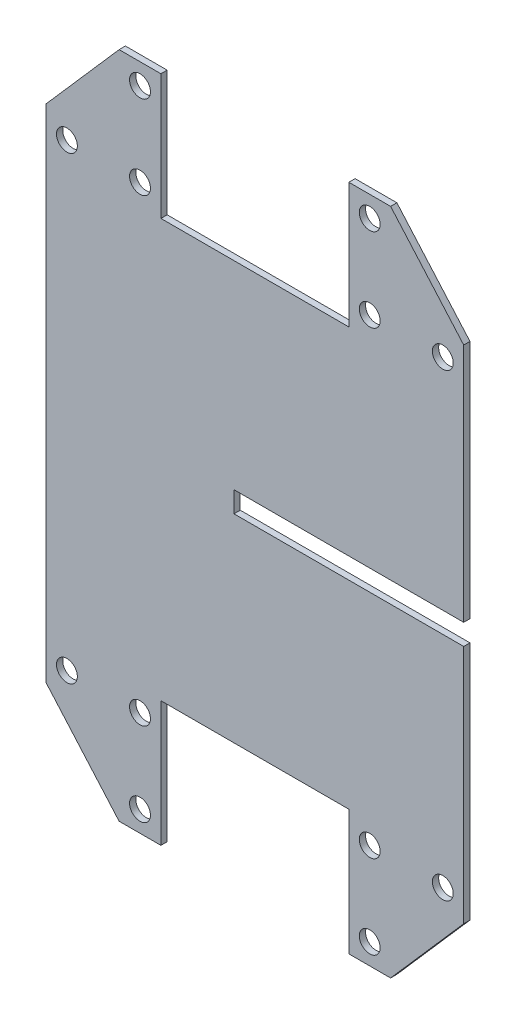
ISO-10303-21;
HEADER;
FILE_DESCRIPTION(('STEP AP214'),'2;1');
FILE_NAME('part.step','',(''),(''),'','','');
FILE_SCHEMA(('AUTOMOTIVE_DESIGN { 1 0 10303 214 1 1 1 1 }'));
ENDSEC;
DATA;
#1=APPLICATION_CONTEXT('core data for automotive mechanical design processes');
#2=APPLICATION_PROTOCOL_DEFINITION('international standard','automotive_design',2000,#1);
#3=PRODUCT_CONTEXT('',#1,'mechanical');
#4=PRODUCT('Part','Part','',(#3));
#5=PRODUCT_RELATED_PRODUCT_CATEGORY('part','',(#4));
#6=PRODUCT_DEFINITION_FORMATION('','',#4);
#7=PRODUCT_DEFINITION_CONTEXT('part definition',#1,'design');
#8=PRODUCT_DEFINITION('design','',#6,#7);
#9=PRODUCT_DEFINITION_SHAPE('','',#8);
#10=(LENGTH_UNIT() NAMED_UNIT(*) SI_UNIT(.MILLI.,.METRE.));
#11=(NAMED_UNIT(*) PLANE_ANGLE_UNIT() SI_UNIT($,.RADIAN.));
#12=(NAMED_UNIT(*) SI_UNIT($,.STERADIAN.) SOLID_ANGLE_UNIT());
#13=UNCERTAINTY_MEASURE_WITH_UNIT(LENGTH_MEASURE(1.E-05),#10,'distance_accuracy_value','');
#14=(GEOMETRIC_REPRESENTATION_CONTEXT(3) GLOBAL_UNCERTAINTY_ASSIGNED_CONTEXT((#13)) GLOBAL_UNIT_ASSIGNED_CONTEXT((#10,
#11,#12)) REPRESENTATION_CONTEXT('',''));
#15=CARTESIAN_POINT('',(0.,0.,0.));
#16=DIRECTION('',(0.,0.,1.));
#17=DIRECTION('',(1.,0.,0.));
#18=AXIS2_PLACEMENT_3D('',#15,#16,#17);
#19=CARTESIAN_POINT('',(0.,160.,3.));
#20=DIRECTION('',(0.,1.,0.));
#21=DIRECTION('',(0.,0.,1.));
#22=AXIS2_PLACEMENT_3D('',#19,#20,#21);
#23=PLANE('',#22);
#24=DIRECTION('',(1.,0.,0.));
#25=VECTOR('',#24,1.);
#26=CARTESIAN_POINT('',(0.,160.,0.));
#27=LINE('',#26,#25);
#28=CARTESIAN_POINT('',(35.,160.,0.));
#29=VERTEX_POINT('',#28);
#30=CARTESIAN_POINT('',(55.,160.,0.));
#31=VERTEX_POINT('',#30);
#32=EDGE_CURVE('E168',#29,#31,#27,.T.);
#33=ORIENTED_EDGE('',*,*,#32,.F.);
#34=DIRECTION('',(0.,0.,-1.));
#35=VECTOR('',#34,1.);
#36=CARTESIAN_POINT('',(35.,160.,3.));
#37=LINE('',#36,#35);
#38=CARTESIAN_POINT('',(35.,160.,3.));
#39=VERTEX_POINT('',#38);
#40=EDGE_CURVE('E11',#39,#29,#37,.T.);
#41=ORIENTED_EDGE('',*,*,#40,.F.);
#42=DIRECTION('',(1.,0.,0.));
#43=VECTOR('',#42,1.);
#44=CARTESIAN_POINT('',(0.,160.,3.));
#45=LINE('',#44,#43);
#46=CARTESIAN_POINT('',(55.,160.,3.));
#47=VERTEX_POINT('',#46);
#48=EDGE_CURVE('E297',#39,#47,#45,.T.);
#49=ORIENTED_EDGE('',*,*,#48,.T.);
#50=DIRECTION('',(0.,0.,-1.));
#51=VECTOR('',#50,1.);
#52=CARTESIAN_POINT('',(55.,160.,3.));
#53=LINE('',#52,#51);
#54=EDGE_CURVE('E95',#47,#31,#53,.T.);
#55=ORIENTED_EDGE('',*,*,#54,.T.);
#56=EDGE_LOOP('',(#33,#41,#49,#55));
#57=FACE_BOUND('',#56,.T.);
#58=ADVANCED_FACE('F37',(#57),#23,.T.);
#59=CARTESIAN_POINT('',(-59.4690265486726,52.0353982300884,3.));
#60=DIRECTION('',(0.752576694706878,-0.658504607868518,0.));
#61=DIRECTION('',(0.658504607868518,0.752576694706878,0.));
#62=AXIS2_PLACEMENT_3D('',#59,#60,#61);
#63=PLANE('',#62);
#64=DIRECTION('',(-0.658504607868518,-0.752576694706878,0.));
#65=VECTOR('',#64,1.);
#66=CARTESIAN_POINT('',(-59.4690265486726,52.0353982300884,0.));
#67=LINE('',#66,#65);
#68=CARTESIAN_POINT('',(0.,120.,0.));
#69=VERTEX_POINT('',#68);
#70=EDGE_CURVE('E171',#29,#69,#67,.T.);
#71=ORIENTED_EDGE('',*,*,#70,.T.);
#72=DIRECTION('',(0.,0.,-1.));
#73=VECTOR('',#72,1.);
#74=CARTESIAN_POINT('',(0.,120.,3.));
#75=LINE('',#74,#73);
#76=CARTESIAN_POINT('',(0.,120.,3.));
#77=VERTEX_POINT('',#76);
#78=EDGE_CURVE('E46',#77,#69,#75,.T.);
#79=ORIENTED_EDGE('',*,*,#78,.F.);
#80=DIRECTION('',(-0.658504607868518,-0.752576694706878,0.));
#81=VECTOR('',#80,1.);
#82=CARTESIAN_POINT('',(-59.4690265486726,52.0353982300884,3.));
#83=LINE('',#82,#81);
#84=EDGE_CURVE('E299',#39,#77,#83,.T.);
#85=ORIENTED_EDGE('',*,*,#84,.F.);
#86=ORIENTED_EDGE('',*,*,#40,.T.);
#87=EDGE_LOOP('',(#71,#79,#85,#86));
#88=FACE_BOUND('',#87,.T.);
#89=ADVANCED_FACE('F229',(#88),#63,.F.);
#90=CARTESIAN_POINT('',(0.,0.,3.));
#91=DIRECTION('',(-1.,0.,0.));
#92=DIRECTION('',(0.,0.,1.));
#93=AXIS2_PLACEMENT_3D('',#90,#91,#92);
#94=PLANE('',#93);
#95=DIRECTION('',(0.,1.,0.));
#96=VECTOR('',#95,1.);
#97=CARTESIAN_POINT('',(0.,0.,0.));
#98=LINE('',#97,#96);
#99=CARTESIAN_POINT('',(0.,-120.,0.));
#100=VERTEX_POINT('',#99);
#101=EDGE_CURVE('E174',#100,#69,#98,.T.);
#102=ORIENTED_EDGE('',*,*,#101,.F.);
#103=DIRECTION('',(0.,0.,-1.));
#104=VECTOR('',#103,1.);
#105=CARTESIAN_POINT('',(0.,-120.,3.));
#106=LINE('',#105,#104);
#107=CARTESIAN_POINT('',(0.,-120.,3.));
#108=VERTEX_POINT('',#107);
#109=EDGE_CURVE('E263',#108,#100,#106,.T.);
#110=ORIENTED_EDGE('',*,*,#109,.F.);
#111=DIRECTION('',(0.,1.,0.));
#112=VECTOR('',#111,1.);
#113=CARTESIAN_POINT('',(0.,0.,3.));
#114=LINE('',#113,#112);
#115=EDGE_CURVE('E226',#108,#77,#114,.T.);
#116=ORIENTED_EDGE('',*,*,#115,.T.);
#117=ORIENTED_EDGE('',*,*,#78,.T.);
#118=EDGE_LOOP('',(#102,#110,#116,#117));
#119=FACE_BOUND('',#118,.T.);
#120=ADVANCED_FACE('F221',(#119),#94,.T.);
#121=CARTESIAN_POINT('',(90.,2.4980018054066E-13,3.));
#122=DIRECTION('',(-1.,0.,0.));
#123=DIRECTION('',(0.,-1.,0.));
#124=AXIS2_PLACEMENT_3D('',#121,#122,#123);
#125=PLANE('',#124);
#126=DIRECTION('',(0.,1.,0.));
#127=VECTOR('',#126,1.);
#128=CARTESIAN_POINT('',(90.,2.4980018054066E-13,0.));
#129=LINE('',#128,#127);
#130=CARTESIAN_POINT('',(90.,-4.99999999999999,0.));
#131=VERTEX_POINT('',#130);
#132=CARTESIAN_POINT('',(90.,4.99999999999998,0.));
#133=VERTEX_POINT('',#132);
#134=EDGE_CURVE('E177',#131,#133,#129,.T.);
#135=ORIENTED_EDGE('',*,*,#134,.T.);
#136=DIRECTION('',(0.,0.,-1.));
#137=VECTOR('',#136,1.);
#138=CARTESIAN_POINT('',(90.,4.99999999999998,3.));
#139=LINE('',#138,#137);
#140=CARTESIAN_POINT('',(90.,4.99999999999998,3.));
#141=VERTEX_POINT('',#140);
#142=EDGE_CURVE('E216',#141,#133,#139,.T.);
#143=ORIENTED_EDGE('',*,*,#142,.F.);
#144=DIRECTION('',(0.,1.,0.));
#145=VECTOR('',#144,1.);
#146=CARTESIAN_POINT('',(90.,2.4980018054066E-13,3.));
#147=LINE('',#146,#145);
#148=CARTESIAN_POINT('',(90.,-4.99999999999999,3.));
#149=VERTEX_POINT('',#148);
#150=EDGE_CURVE('E302',#149,#141,#147,.T.);
#151=ORIENTED_EDGE('',*,*,#150,.F.);
#152=DIRECTION('',(0.,0.,-1.));
#153=VECTOR('',#152,1.);
#154=CARTESIAN_POINT('',(90.,-4.99999999999999,3.));
#155=LINE('',#154,#153);
#156=EDGE_CURVE('E266',#149,#131,#155,.T.);
#157=ORIENTED_EDGE('',*,*,#156,.T.);
#158=EDGE_LOOP('',(#135,#143,#151,#157));
#159=FACE_BOUND('',#158,.T.);
#160=ADVANCED_FACE('F434',(#159),#125,.F.);
#161=CARTESIAN_POINT('',(0.,4.99999999999997,3.));
#162=DIRECTION('',(0.,-1.,0.));
#163=DIRECTION('',(1.,0.,0.));
#164=AXIS2_PLACEMENT_3D('',#161,#162,#163);
#165=PLANE('',#164);
#166=DIRECTION('',(-1.,0.,0.));
#167=VECTOR('',#166,1.);
#168=CARTESIAN_POINT('',(0.,4.99999999999997,0.));
#169=LINE('',#168,#167);
#170=CARTESIAN_POINT('',(200.,5.,0.));
#171=VERTEX_POINT('',#170);
#172=EDGE_CURVE('E180',#171,#133,#169,.T.);
#173=ORIENTED_EDGE('',*,*,#172,.F.);
#174=DIRECTION('',(0.,0.,-1.));
#175=VECTOR('',#174,1.);
#176=CARTESIAN_POINT('',(200.,5.,3.));
#177=LINE('',#176,#175);
#178=CARTESIAN_POINT('',(200.,5.,3.));
#179=VERTEX_POINT('',#178);
#180=EDGE_CURVE('E214',#179,#171,#177,.T.);
#181=ORIENTED_EDGE('',*,*,#180,.F.);
#182=DIRECTION('',(-1.,0.,0.));
#183=VECTOR('',#182,1.);
#184=CARTESIAN_POINT('',(0.,4.99999999999997,3.));
#185=LINE('',#184,#183);
#186=EDGE_CURVE('E304',#179,#141,#185,.T.);
#187=ORIENTED_EDGE('',*,*,#186,.T.);
#188=ORIENTED_EDGE('',*,*,#142,.T.);
#189=EDGE_LOOP('',(#173,#181,#187,#188));
#190=FACE_BOUND('',#189,.T.);
#191=ADVANCED_FACE('F443',(#190),#165,.T.);
#192=CARTESIAN_POINT('',(200.,0.,3.));
#193=DIRECTION('',(1.,0.,0.));
#194=DIRECTION('',(0.,0.,-1.));
#195=AXIS2_PLACEMENT_3D('',#192,#193,#194);
#196=PLANE('',#195);
#197=DIRECTION('',(0.,-1.,0.));
#198=VECTOR('',#197,1.);
#199=CARTESIAN_POINT('',(200.,0.,0.));
#200=LINE('',#199,#198);
#201=CARTESIAN_POINT('',(200.,120.,0.));
#202=VERTEX_POINT('',#201);
#203=EDGE_CURVE('E183',#202,#171,#200,.T.);
#204=ORIENTED_EDGE('',*,*,#203,.F.);
#205=DIRECTION('',(0.,0.,-1.));
#206=VECTOR('',#205,1.);
#207=CARTESIAN_POINT('',(200.,120.,3.));
#208=LINE('',#207,#206);
#209=CARTESIAN_POINT('',(200.,120.,3.));
#210=VERTEX_POINT('',#209);
#211=EDGE_CURVE('E212',#210,#202,#208,.T.);
#212=ORIENTED_EDGE('',*,*,#211,.F.);
#213=DIRECTION('',(0.,-1.,0.));
#214=VECTOR('',#213,1.);
#215=CARTESIAN_POINT('',(200.,0.,3.));
#216=LINE('',#215,#214);
#217=EDGE_CURVE('E307',#210,#179,#216,.T.);
#218=ORIENTED_EDGE('',*,*,#217,.T.);
#219=ORIENTED_EDGE('',*,*,#180,.T.);
#220=EDGE_LOOP('',(#204,#212,#218,#219));
#221=FACE_BOUND('',#220,.T.);
#222=ADVANCED_FACE('F319',(#221),#196,.T.);
#223=CARTESIAN_POINT('',(172.743362831858,151.150442477876,3.));
#224=DIRECTION('',(0.752576694706877,0.658504607868518,0.));
#225=DIRECTION('',(-0.658504607868519,0.752576694706877,0.));
#226=AXIS2_PLACEMENT_3D('',#223,#224,#225);
#227=PLANE('',#226);
#228=DIRECTION('',(0.658504607868519,-0.752576694706877,0.));
#229=VECTOR('',#228,1.);
#230=CARTESIAN_POINT('',(172.743362831858,151.150442477876,0.));
#231=LINE('',#230,#229);
#232=CARTESIAN_POINT('',(165.,160.,0.));
#233=VERTEX_POINT('',#232);
#234=EDGE_CURVE('E186',#233,#202,#231,.T.);
#235=ORIENTED_EDGE('',*,*,#234,.F.);
#236=DIRECTION('',(0.,0.,-1.));
#237=VECTOR('',#236,1.);
#238=CARTESIAN_POINT('',(165.,160.,3.));
#239=LINE('',#238,#237);
#240=CARTESIAN_POINT('',(165.,160.,3.));
#241=VERTEX_POINT('',#240);
#242=EDGE_CURVE('E210',#241,#233,#239,.T.);
#243=ORIENTED_EDGE('',*,*,#242,.F.);
#244=DIRECTION('',(0.658504607868519,-0.752576694706877,0.));
#245=VECTOR('',#244,1.);
#246=CARTESIAN_POINT('',(172.743362831858,151.150442477876,3.));
#247=LINE('',#246,#245);
#248=EDGE_CURVE('E310',#241,#210,#247,.T.);
#249=ORIENTED_EDGE('',*,*,#248,.T.);
#250=ORIENTED_EDGE('',*,*,#211,.T.);
#251=EDGE_LOOP('',(#235,#243,#249,#250));
#252=FACE_BOUND('',#251,.T.);
#253=ADVANCED_FACE('F314',(#252),#227,.T.);
#254=CARTESIAN_POINT('',(0.,160.,3.));
#255=DIRECTION('',(0.,-1.,0.));
#256=DIRECTION('',(0.,0.,-1.));
#257=AXIS2_PLACEMENT_3D('',#254,#255,#256);
#258=PLANE('',#257);
#259=DIRECTION('',(-1.,0.,0.));
#260=VECTOR('',#259,1.);
#261=CARTESIAN_POINT('',(0.,160.,0.));
#262=LINE('',#261,#260);
#263=CARTESIAN_POINT('',(145.,160.,0.));
#264=VERTEX_POINT('',#263);
#265=EDGE_CURVE('E189',#233,#264,#262,.T.);
#266=ORIENTED_EDGE('',*,*,#265,.T.);
#267=DIRECTION('',(0.,0.,-1.));
#268=VECTOR('',#267,1.);
#269=CARTESIAN_POINT('',(145.,160.,3.));
#270=LINE('',#269,#268);
#271=CARTESIAN_POINT('',(145.,160.,3.));
#272=VERTEX_POINT('',#271);
#273=EDGE_CURVE('E134',#272,#264,#270,.T.);
#274=ORIENTED_EDGE('',*,*,#273,.F.);
#275=DIRECTION('',(-1.,0.,0.));
#276=VECTOR('',#275,1.);
#277=CARTESIAN_POINT('',(0.,160.,3.));
#278=LINE('',#277,#276);
#279=EDGE_CURVE('E141',#241,#272,#278,.T.);
#280=ORIENTED_EDGE('',*,*,#279,.F.);
#281=ORIENTED_EDGE('',*,*,#242,.T.);
#282=EDGE_LOOP('',(#266,#274,#280,#281));
#283=FACE_BOUND('',#282,.T.);
#284=ADVANCED_FACE('F323',(#283),#258,.F.);
#285=CARTESIAN_POINT('',(145.,0.,3.));
#286=DIRECTION('',(-1.,0.,0.));
#287=DIRECTION('',(0.,0.,1.));
#288=AXIS2_PLACEMENT_3D('',#285,#286,#287);
#289=PLANE('',#288);
#290=DIRECTION('',(0.,1.,0.));
#291=VECTOR('',#290,1.);
#292=CARTESIAN_POINT('',(145.,0.,0.));
#293=LINE('',#292,#291);
#294=CARTESIAN_POINT('',(145.,100.,0.));
#295=VERTEX_POINT('',#294);
#296=EDGE_CURVE('E129',#295,#264,#293,.T.);
#297=ORIENTED_EDGE('',*,*,#296,.F.);
#298=DIRECTION('',(0.,0.,-1.));
#299=VECTOR('',#298,1.);
#300=CARTESIAN_POINT('',(145.,100.,3.));
#301=LINE('',#300,#299);
#302=CARTESIAN_POINT('',(145.,100.,3.));
#303=VERTEX_POINT('',#302);
#304=EDGE_CURVE('E124',#303,#295,#301,.T.);
#305=ORIENTED_EDGE('',*,*,#304,.F.);
#306=DIRECTION('',(0.,1.,0.));
#307=VECTOR('',#306,1.);
#308=CARTESIAN_POINT('',(145.,0.,3.));
#309=LINE('',#308,#307);
#310=EDGE_CURVE('E127',#303,#272,#309,.T.);
#311=ORIENTED_EDGE('',*,*,#310,.T.);
#312=ORIENTED_EDGE('',*,*,#273,.T.);
#313=EDGE_LOOP('',(#297,#305,#311,#312));
#314=FACE_BOUND('',#313,.T.);
#315=ADVANCED_FACE('F126',(#314),#289,.T.);
#316=CARTESIAN_POINT('',(0.,100.,3.));
#317=DIRECTION('',(0.,1.,0.));
#318=DIRECTION('',(0.,0.,1.));
#319=AXIS2_PLACEMENT_3D('',#316,#317,#318);
#320=PLANE('',#319);
#321=DIRECTION('',(1.,0.,0.));
#322=VECTOR('',#321,1.);
#323=CARTESIAN_POINT('',(0.,100.,0.));
#324=LINE('',#323,#322);
#325=CARTESIAN_POINT('',(55.,100.,0.));
#326=VERTEX_POINT('',#325);
#327=EDGE_CURVE('E193',#326,#295,#324,.T.);
#328=ORIENTED_EDGE('',*,*,#327,.F.);
#329=DIRECTION('',(0.,0.,-1.));
#330=VECTOR('',#329,1.);
#331=CARTESIAN_POINT('',(55.,100.,3.));
#332=LINE('',#331,#330);
#333=CARTESIAN_POINT('',(55.,100.,3.));
#334=VERTEX_POINT('',#333);
#335=EDGE_CURVE('E88',#334,#326,#332,.T.);
#336=ORIENTED_EDGE('',*,*,#335,.F.);
#337=DIRECTION('',(1.,0.,0.));
#338=VECTOR('',#337,1.);
#339=CARTESIAN_POINT('',(0.,100.,3.));
#340=LINE('',#339,#338);
#341=EDGE_CURVE('E138',#334,#303,#340,.T.);
#342=ORIENTED_EDGE('',*,*,#341,.T.);
#343=ORIENTED_EDGE('',*,*,#304,.T.);
#344=EDGE_LOOP('',(#328,#336,#342,#343));
#345=FACE_BOUND('',#344,.T.);
#346=ADVANCED_FACE('F144',(#345),#320,.T.);
#347=CARTESIAN_POINT('',(155.,150.,3.));
#348=DIRECTION('',(0.,0.,-1.));
#349=DIRECTION('',(-1.,0.,0.));
#350=AXIS2_PLACEMENT_3D('',#347,#348,#349);
#351=CYLINDRICAL_SURFACE('',#350,4.99999999999999);
#352=CARTESIAN_POINT('',(155.,150.,3.));
#353=DIRECTION('',(0.,0.,1.));
#354=DIRECTION('',(1.,0.,0.));
#355=AXIS2_PLACEMENT_3D('',#352,#353,#354);
#356=CIRCLE('',#355,4.99999999999999);
#357=CARTESIAN_POINT('',(160.,150.,3.));
#358=VERTEX_POINT('',#357);
#359=EDGE_CURVE('E152',#358,#358,#356,.T.);
#360=ORIENTED_EDGE('',*,*,#359,.T.);
#361=EDGE_LOOP('',(#360));
#362=FACE_BOUND('',#361,.T.);
#363=CARTESIAN_POINT('',(155.,150.,0.));
#364=DIRECTION('',(0.,0.,1.));
#365=DIRECTION('',(1.,0.,0.));
#366=AXIS2_PLACEMENT_3D('',#363,#364,#365);
#367=CIRCLE('',#366,4.99999999999999);
#368=CARTESIAN_POINT('',(160.,150.,0.));
#369=VERTEX_POINT('',#368);
#370=EDGE_CURVE('E200',#369,#369,#367,.T.);
#371=ORIENTED_EDGE('',*,*,#370,.F.);
#372=EDGE_LOOP('',(#371));
#373=FACE_BOUND('',#372,.T.);
#374=ADVANCED_FACE('F377',(#362,#373),#351,.F.);
#375=CARTESIAN_POINT('',(155.,110.,3.));
#376=DIRECTION('',(0.,0.,-1.));
#377=DIRECTION('',(-1.,0.,0.));
#378=AXIS2_PLACEMENT_3D('',#375,#376,#377);
#379=CYLINDRICAL_SURFACE('',#378,4.99999999999999);
#380=CARTESIAN_POINT('',(155.,110.,3.));
#381=DIRECTION('',(0.,0.,1.));
#382=DIRECTION('',(1.,0.,0.));
#383=AXIS2_PLACEMENT_3D('',#380,#381,#382);
#384=CIRCLE('',#383,4.99999999999999);
#385=CARTESIAN_POINT('',(160.,110.,3.));
#386=VERTEX_POINT('',#385);
#387=EDGE_CURVE('E146',#386,#386,#384,.T.);
#388=ORIENTED_EDGE('',*,*,#387,.T.);
#389=EDGE_LOOP('',(#388));
#390=FACE_BOUND('',#389,.T.);
#391=CARTESIAN_POINT('',(155.,110.,0.));
#392=DIRECTION('',(0.,0.,1.));
#393=DIRECTION('',(1.,0.,0.));
#394=AXIS2_PLACEMENT_3D('',#391,#392,#393);
#395=CIRCLE('',#394,4.99999999999999);
#396=CARTESIAN_POINT('',(160.,110.,0.));
#397=VERTEX_POINT('',#396);
#398=EDGE_CURVE('E197',#397,#397,#395,.T.);
#399=ORIENTED_EDGE('',*,*,#398,.F.);
#400=EDGE_LOOP('',(#399));
#401=FACE_BOUND('',#400,.T.);
#402=ADVANCED_FACE('F380',(#390,#401),#379,.F.);
#403=CARTESIAN_POINT('',(55.,0.,3.));
#404=DIRECTION('',(-1.,0.,0.));
#405=DIRECTION('',(0.,0.,1.));
#406=AXIS2_PLACEMENT_3D('',#403,#404,#405);
#407=PLANE('',#406);
#408=DIRECTION('',(0.,1.,0.));
#409=VECTOR('',#408,1.);
#410=CARTESIAN_POINT('',(55.,0.,0.));
#411=LINE('',#410,#409);
#412=EDGE_CURVE('E195',#326,#31,#411,.T.);
#413=ORIENTED_EDGE('',*,*,#412,.T.);
#414=ORIENTED_EDGE('',*,*,#54,.F.);
#415=DIRECTION('',(0.,1.,0.));
#416=VECTOR('',#415,1.);
#417=CARTESIAN_POINT('',(55.,0.,3.));
#418=LINE('',#417,#416);
#419=EDGE_CURVE('E54',#334,#47,#418,.T.);
#420=ORIENTED_EDGE('',*,*,#419,.F.);
#421=ORIENTED_EDGE('',*,*,#335,.T.);
#422=EDGE_LOOP('',(#413,#414,#420,#421));
#423=FACE_BOUND('',#422,.T.);
#424=ADVANCED_FACE('F343',(#423),#407,.F.);
#425=CARTESIAN_POINT('',(10.,110.,3.));
#426=DIRECTION('',(0.,0.,-1.));
#427=DIRECTION('',(-1.,0.,0.));
#428=AXIS2_PLACEMENT_3D('',#425,#426,#427);
#429=CYLINDRICAL_SURFACE('',#428,5.);
#430=CARTESIAN_POINT('',(10.,110.,3.));
#431=DIRECTION('',(0.,0.,1.));
#432=DIRECTION('',(1.,0.,0.));
#433=AXIS2_PLACEMENT_3D('',#430,#431,#432);
#434=CIRCLE('',#433,5.);
#435=CARTESIAN_POINT('',(15.,110.,3.));
#436=VERTEX_POINT('',#435);
#437=EDGE_CURVE('E294',#436,#436,#434,.T.);
#438=ORIENTED_EDGE('',*,*,#437,.T.);
#439=EDGE_LOOP('',(#438));
#440=FACE_BOUND('',#439,.T.);
#441=CARTESIAN_POINT('',(10.,110.,0.));
#442=DIRECTION('',(0.,0.,1.));
#443=DIRECTION('',(1.,0.,0.));
#444=AXIS2_PLACEMENT_3D('',#441,#442,#443);
#445=CIRCLE('',#444,5.);
#446=CARTESIAN_POINT('',(15.,110.,0.));
#447=VERTEX_POINT('',#446);
#448=EDGE_CURVE('E165',#447,#447,#445,.T.);
#449=ORIENTED_EDGE('',*,*,#448,.F.);
#450=EDGE_LOOP('',(#449));
#451=FACE_BOUND('',#450,.T.);
#452=ADVANCED_FACE('F340',(#440,#451),#429,.F.);
#453=CARTESIAN_POINT('',(45.,150.,3.));
#454=DIRECTION('',(0.,0.,-1.));
#455=DIRECTION('',(-1.,0.,0.));
#456=AXIS2_PLACEMENT_3D('',#453,#454,#455);
#457=CYLINDRICAL_SURFACE('',#456,5.00000000000001);
#458=CARTESIAN_POINT('',(45.,150.,3.));
#459=DIRECTION('',(0.,0.,1.));
#460=DIRECTION('',(1.,0.,0.));
#461=AXIS2_PLACEMENT_3D('',#458,#459,#460);
#462=CIRCLE('',#461,5.00000000000001);
#463=CARTESIAN_POINT('',(50.,150.,3.));
#464=VERTEX_POINT('',#463);
#465=EDGE_CURVE('E291',#464,#464,#462,.T.);
#466=ORIENTED_EDGE('',*,*,#465,.T.);
#467=EDGE_LOOP('',(#466));
#468=FACE_BOUND('',#467,.T.);
#469=CARTESIAN_POINT('',(45.,150.,0.));
#470=DIRECTION('',(0.,0.,1.));
#471=DIRECTION('',(1.,0.,0.));
#472=AXIS2_PLACEMENT_3D('',#469,#470,#471);
#473=CIRCLE('',#472,5.00000000000001);
#474=CARTESIAN_POINT('',(50.,150.,0.));
#475=VERTEX_POINT('',#474);
#476=EDGE_CURVE('E161',#475,#475,#473,.T.);
#477=ORIENTED_EDGE('',*,*,#476,.F.);
#478=EDGE_LOOP('',(#477));
#479=FACE_BOUND('',#478,.T.);
#480=ADVANCED_FACE('F342',(#468,#479),#457,.F.);
#481=CARTESIAN_POINT('',(45.,110.,3.));
#482=DIRECTION('',(0.,0.,-1.));
#483=DIRECTION('',(-1.,0.,0.));
#484=AXIS2_PLACEMENT_3D('',#481,#482,#483);
#485=CYLINDRICAL_SURFACE('',#484,5.00000000000001);
#486=CARTESIAN_POINT('',(45.,110.,3.));
#487=DIRECTION('',(0.,0.,1.));
#488=DIRECTION('',(1.,0.,0.));
#489=AXIS2_PLACEMENT_3D('',#486,#487,#488);
#490=CIRCLE('',#489,5.00000000000001);
#491=CARTESIAN_POINT('',(50.,110.,3.));
#492=VERTEX_POINT('',#491);
#493=EDGE_CURVE('E206',#492,#492,#490,.T.);
#494=ORIENTED_EDGE('',*,*,#493,.T.);
#495=EDGE_LOOP('',(#494));
#496=FACE_BOUND('',#495,.T.);
#497=CARTESIAN_POINT('',(45.,110.,0.));
#498=DIRECTION('',(0.,0.,1.));
#499=DIRECTION('',(1.,0.,0.));
#500=AXIS2_PLACEMENT_3D('',#497,#498,#499);
#501=CIRCLE('',#500,5.00000000000001);
#502=CARTESIAN_POINT('',(50.,110.,0.));
#503=VERTEX_POINT('',#502);
#504=EDGE_CURVE('E158',#503,#503,#501,.T.);
#505=ORIENTED_EDGE('',*,*,#504,.F.);
#506=EDGE_LOOP('',(#505));
#507=FACE_BOUND('',#506,.T.);
#508=ADVANCED_FACE('F39',(#496,#507),#485,.F.);
#509=CARTESIAN_POINT('',(190.,110.,3.));
#510=DIRECTION('',(0.,0.,-1.));
#511=DIRECTION('',(-1.,0.,0.));
#512=AXIS2_PLACEMENT_3D('',#509,#510,#511);
#513=CYLINDRICAL_SURFACE('',#512,4.99999999999999);
#514=CARTESIAN_POINT('',(190.,110.,3.));
#515=DIRECTION('',(0.,0.,1.));
#516=DIRECTION('',(1.,0.,0.));
#517=AXIS2_PLACEMENT_3D('',#514,#515,#516);
#518=CIRCLE('',#517,4.99999999999999);
#519=CARTESIAN_POINT('',(195.,110.,3.));
#520=VERTEX_POINT('',#519);
#521=EDGE_CURVE('E155',#520,#520,#518,.T.);
#522=ORIENTED_EDGE('',*,*,#521,.T.);
#523=EDGE_LOOP('',(#522));
#524=FACE_BOUND('',#523,.T.);
#525=CARTESIAN_POINT('',(190.,110.,0.));
#526=DIRECTION('',(0.,0.,1.));
#527=DIRECTION('',(1.,0.,0.));
#528=AXIS2_PLACEMENT_3D('',#525,#526,#527);
#529=CIRCLE('',#528,4.99999999999999);
#530=CARTESIAN_POINT('',(195.,110.,0.));
#531=VERTEX_POINT('',#530);
#532=EDGE_CURVE('E203',#531,#531,#529,.T.);
#533=ORIENTED_EDGE('',*,*,#532,.F.);
#534=EDGE_LOOP('',(#533));
#535=FACE_BOUND('',#534,.T.);
#536=ADVANCED_FACE('F350',(#524,#535),#513,.F.);
#537=CARTESIAN_POINT('',(0.,0.,3.));
#538=DIRECTION('',(0.,0.,1.));
#539=DIRECTION('',(1.,0.,0.));
#540=AXIS2_PLACEMENT_3D('',#537,#538,#539);
#541=PLANE('',#540);
#542=ORIENTED_EDGE('',*,*,#493,.F.);
#543=EDGE_LOOP('',(#542));
#544=FACE_BOUND('',#543,.T.);
#545=ORIENTED_EDGE('',*,*,#465,.F.);
#546=EDGE_LOOP('',(#545));
#547=FACE_BOUND('',#546,.T.);
#548=ORIENTED_EDGE('',*,*,#437,.F.);
#549=EDGE_LOOP('',(#548));
#550=FACE_BOUND('',#549,.T.);
#551=ORIENTED_EDGE('',*,*,#48,.F.);
#552=ORIENTED_EDGE('',*,*,#84,.T.);
#553=ORIENTED_EDGE('',*,*,#115,.F.);
#554=DIRECTION('',(-0.658504607868518,0.752576694706878,0.));
#555=VECTOR('',#554,1.);
#556=CARTESIAN_POINT('',(-59.4690265486726,-52.0353982300884,3.));
#557=LINE('',#556,#555);
#558=CARTESIAN_POINT('',(35.,-160.,3.));
#559=VERTEX_POINT('',#558);
#560=EDGE_CURVE('E713',#559,#108,#557,.T.);
#561=ORIENTED_EDGE('',*,*,#560,.F.);
#562=DIRECTION('',(1.,0.,0.));
#563=VECTOR('',#562,1.);
#564=CARTESIAN_POINT('',(0.,-160.,3.));
#565=LINE('',#564,#563);
#566=CARTESIAN_POINT('',(55.,-160.,3.));
#567=VERTEX_POINT('',#566);
#568=EDGE_CURVE('E710',#559,#567,#565,.T.);
#569=ORIENTED_EDGE('',*,*,#568,.T.);
#570=DIRECTION('',(0.,-1.,0.));
#571=VECTOR('',#570,1.);
#572=CARTESIAN_POINT('',(55.,0.,3.));
#573=LINE('',#572,#571);
#574=CARTESIAN_POINT('',(55.,-100.,3.));
#575=VERTEX_POINT('',#574);
#576=EDGE_CURVE('E707',#575,#567,#573,.T.);
#577=ORIENTED_EDGE('',*,*,#576,.F.);
#578=DIRECTION('',(1.,0.,0.));
#579=VECTOR('',#578,1.);
#580=CARTESIAN_POINT('',(0.,-100.,3.));
#581=LINE('',#580,#579);
#582=CARTESIAN_POINT('',(145.,-100.,3.));
#583=VERTEX_POINT('',#582);
#584=EDGE_CURVE('E727',#575,#583,#581,.T.);
#585=ORIENTED_EDGE('',*,*,#584,.T.);
#586=DIRECTION('',(0.,-1.,0.));
#587=VECTOR('',#586,1.);
#588=CARTESIAN_POINT('',(145.,0.,3.));
#589=LINE('',#588,#587);
#590=CARTESIAN_POINT('',(145.,-160.,3.));
#591=VERTEX_POINT('',#590);
#592=EDGE_CURVE('E724',#583,#591,#589,.T.);
#593=ORIENTED_EDGE('',*,*,#592,.T.);
#594=DIRECTION('',(-1.,0.,0.));
#595=VECTOR('',#594,1.);
#596=CARTESIAN_POINT('',(0.,-160.,3.));
#597=LINE('',#596,#595);
#598=CARTESIAN_POINT('',(165.,-160.,3.));
#599=VERTEX_POINT('',#598);
#600=EDGE_CURVE('E695',#599,#591,#597,.T.);
#601=ORIENTED_EDGE('',*,*,#600,.F.);
#602=DIRECTION('',(0.658504607868519,0.752576694706877,0.));
#603=VECTOR('',#602,1.);
#604=CARTESIAN_POINT('',(172.743362831858,-151.150442477876,3.));
#605=LINE('',#604,#603);
#606=CARTESIAN_POINT('',(200.,-120.,3.));
#607=VERTEX_POINT('',#606);
#608=EDGE_CURVE('E720',#599,#607,#605,.T.);
#609=ORIENTED_EDGE('',*,*,#608,.T.);
#610=DIRECTION('',(0.,1.,0.));
#611=VECTOR('',#610,1.);
#612=CARTESIAN_POINT('',(200.,0.,3.));
#613=LINE('',#612,#611);
#614=CARTESIAN_POINT('',(200.,-5.,3.));
#615=VERTEX_POINT('',#614);
#616=EDGE_CURVE('E716',#607,#615,#613,.T.);
#617=ORIENTED_EDGE('',*,*,#616,.T.);
#618=DIRECTION('',(-1.,0.,0.));
#619=VECTOR('',#618,1.);
#620=CARTESIAN_POINT('',(0.,-4.99999999999997,3.));
#621=LINE('',#620,#619);
#622=EDGE_CURVE('E661',#615,#149,#621,.T.);
#623=ORIENTED_EDGE('',*,*,#622,.T.);
#624=ORIENTED_EDGE('',*,*,#150,.T.);
#625=ORIENTED_EDGE('',*,*,#186,.F.);
#626=ORIENTED_EDGE('',*,*,#217,.F.);
#627=ORIENTED_EDGE('',*,*,#248,.F.);
#628=ORIENTED_EDGE('',*,*,#279,.T.);
#629=ORIENTED_EDGE('',*,*,#310,.F.);
#630=ORIENTED_EDGE('',*,*,#341,.F.);
#631=ORIENTED_EDGE('',*,*,#419,.T.);
#632=EDGE_LOOP('',(#551,#552,#553,#561,#569,#577,#585,#593,#601,#609,#617,#623,#624,#625,#626,
#627,#628,#629,#630,#631));
#633=FACE_BOUND('',#632,.T.);
#634=ORIENTED_EDGE('',*,*,#387,.F.);
#635=EDGE_LOOP('',(#634));
#636=FACE_BOUND('',#635,.T.);
#637=ORIENTED_EDGE('',*,*,#359,.F.);
#638=EDGE_LOOP('',(#637));
#639=FACE_BOUND('',#638,.T.);
#640=ORIENTED_EDGE('',*,*,#521,.F.);
#641=EDGE_LOOP('',(#640));
#642=FACE_BOUND('',#641,.T.);
#643=CARTESIAN_POINT('',(45.,-110.,3.));
#644=DIRECTION('',(0.,0.,-1.));
#645=DIRECTION('',(1.,0.,0.));
#646=AXIS2_PLACEMENT_3D('',#643,#644,#645);
#647=CIRCLE('',#646,5.00000000000001);
#648=CARTESIAN_POINT('',(50.,-110.,3.));
#649=VERTEX_POINT('',#648);
#650=EDGE_CURVE('E259',#649,#649,#647,.T.);
#651=ORIENTED_EDGE('',*,*,#650,.T.);
#652=EDGE_LOOP('',(#651));
#653=FACE_BOUND('',#652,.T.);
#654=CARTESIAN_POINT('',(45.,-150.,3.));
#655=DIRECTION('',(0.,0.,-1.));
#656=DIRECTION('',(1.,0.,0.));
#657=AXIS2_PLACEMENT_3D('',#654,#655,#656);
#658=CIRCLE('',#657,5.00000000000001);
#659=CARTESIAN_POINT('',(50.,-150.,3.));
#660=VERTEX_POINT('',#659);
#661=EDGE_CURVE('E735',#660,#660,#658,.T.);
#662=ORIENTED_EDGE('',*,*,#661,.T.);
#663=EDGE_LOOP('',(#662));
#664=FACE_BOUND('',#663,.T.);
#665=CARTESIAN_POINT('',(9.99999999999999,-110.,3.));
#666=DIRECTION('',(0.,0.,-1.));
#667=DIRECTION('',(1.,0.,0.));
#668=AXIS2_PLACEMENT_3D('',#665,#666,#667);
#669=CIRCLE('',#668,5.);
#670=CARTESIAN_POINT('',(15.,-110.,3.));
#671=VERTEX_POINT('',#670);
#672=EDGE_CURVE('E732',#671,#671,#669,.T.);
#673=ORIENTED_EDGE('',*,*,#672,.T.);
#674=EDGE_LOOP('',(#673));
#675=FACE_BOUND('',#674,.T.);
#676=CARTESIAN_POINT('',(155.,-110.,3.));
#677=DIRECTION('',(0.,0.,-1.));
#678=DIRECTION('',(1.,0.,0.));
#679=AXIS2_PLACEMENT_3D('',#676,#677,#678);
#680=CIRCLE('',#679,4.99999999999999);
#681=CARTESIAN_POINT('',(160.,-110.,3.));
#682=VERTEX_POINT('',#681);
#683=EDGE_CURVE('E620',#682,#682,#680,.T.);
#684=ORIENTED_EDGE('',*,*,#683,.T.);
#685=EDGE_LOOP('',(#684));
#686=FACE_BOUND('',#685,.T.);
#687=CARTESIAN_POINT('',(155.,-150.,3.));
#688=DIRECTION('',(0.,0.,-1.));
#689=DIRECTION('',(1.,0.,0.));
#690=AXIS2_PLACEMENT_3D('',#687,#688,#689);
#691=CIRCLE('',#690,4.99999999999999);
#692=CARTESIAN_POINT('',(160.,-150.,3.));
#693=VERTEX_POINT('',#692);
#694=EDGE_CURVE('E617',#693,#693,#691,.T.);
#695=ORIENTED_EDGE('',*,*,#694,.T.);
#696=EDGE_LOOP('',(#695));
#697=FACE_BOUND('',#696,.T.);
#698=CARTESIAN_POINT('',(190.,-110.,3.));
#699=DIRECTION('',(0.,0.,-1.));
#700=DIRECTION('',(1.,0.,0.));
#701=AXIS2_PLACEMENT_3D('',#698,#699,#700);
#702=CIRCLE('',#701,4.99999999999999);
#703=CARTESIAN_POINT('',(195.,-110.,3.));
#704=VERTEX_POINT('',#703);
#705=EDGE_CURVE('E264',#704,#704,#702,.T.);
#706=ORIENTED_EDGE('',*,*,#705,.T.);
#707=EDGE_LOOP('',(#706));
#708=FACE_BOUND('',#707,.T.);
#709=ADVANCED_FACE('F136',(#544,#547,#550,#633,#636,#639,#642,#653,#664,#675,#686,#697,#708),
#541,.T.);
#710=CARTESIAN_POINT('',(0.,0.,0.));
#711=DIRECTION('',(0.,0.,1.));
#712=DIRECTION('',(1.,0.,0.));
#713=AXIS2_PLACEMENT_3D('',#710,#711,#712);
#714=PLANE('',#713);
#715=ORIENTED_EDGE('',*,*,#504,.T.);
#716=EDGE_LOOP('',(#715));
#717=FACE_BOUND('',#716,.T.);
#718=ORIENTED_EDGE('',*,*,#476,.T.);
#719=EDGE_LOOP('',(#718));
#720=FACE_BOUND('',#719,.T.);
#721=ORIENTED_EDGE('',*,*,#448,.T.);
#722=EDGE_LOOP('',(#721));
#723=FACE_BOUND('',#722,.T.);
#724=ORIENTED_EDGE('',*,*,#32,.T.);
#725=ORIENTED_EDGE('',*,*,#412,.F.);
#726=ORIENTED_EDGE('',*,*,#327,.T.);
#727=ORIENTED_EDGE('',*,*,#296,.T.);
#728=ORIENTED_EDGE('',*,*,#265,.F.);
#729=ORIENTED_EDGE('',*,*,#234,.T.);
#730=ORIENTED_EDGE('',*,*,#203,.T.);
#731=ORIENTED_EDGE('',*,*,#172,.T.);
#732=ORIENTED_EDGE('',*,*,#134,.F.);
#733=DIRECTION('',(-1.,0.,0.));
#734=VECTOR('',#733,1.);
#735=CARTESIAN_POINT('',(0.,-4.99999999999997,0.));
#736=LINE('',#735,#734);
#737=CARTESIAN_POINT('',(200.,-5.,0.));
#738=VERTEX_POINT('',#737);
#739=EDGE_CURVE('E244',#738,#131,#736,.T.);
#740=ORIENTED_EDGE('',*,*,#739,.F.);
#741=DIRECTION('',(0.,1.,0.));
#742=VECTOR('',#741,1.);
#743=CARTESIAN_POINT('',(200.,0.,0.));
#744=LINE('',#743,#742);
#745=CARTESIAN_POINT('',(200.,-120.,0.));
#746=VERTEX_POINT('',#745);
#747=EDGE_CURVE('E250',#746,#738,#744,.T.);
#748=ORIENTED_EDGE('',*,*,#747,.F.);
#749=DIRECTION('',(0.658504607868519,0.752576694706877,0.));
#750=VECTOR('',#749,1.);
#751=CARTESIAN_POINT('',(172.743362831858,-151.150442477876,0.));
#752=LINE('',#751,#750);
#753=CARTESIAN_POINT('',(165.,-160.,0.));
#754=VERTEX_POINT('',#753);
#755=EDGE_CURVE('E645',#754,#746,#752,.T.);
#756=ORIENTED_EDGE('',*,*,#755,.F.);
#757=DIRECTION('',(-1.,0.,0.));
#758=VECTOR('',#757,1.);
#759=CARTESIAN_POINT('',(0.,-160.,0.));
#760=LINE('',#759,#758);
#761=CARTESIAN_POINT('',(145.,-160.,0.));
#762=VERTEX_POINT('',#761);
#763=EDGE_CURVE('E642',#754,#762,#760,.T.);
#764=ORIENTED_EDGE('',*,*,#763,.T.);
#765=DIRECTION('',(0.,-1.,0.));
#766=VECTOR('',#765,1.);
#767=CARTESIAN_POINT('',(145.,0.,0.));
#768=LINE('',#767,#766);
#769=CARTESIAN_POINT('',(145.,-100.,0.));
#770=VERTEX_POINT('',#769);
#771=EDGE_CURVE('E639',#770,#762,#768,.T.);
#772=ORIENTED_EDGE('',*,*,#771,.F.);
#773=DIRECTION('',(1.,0.,0.));
#774=VECTOR('',#773,1.);
#775=CARTESIAN_POINT('',(0.,-100.,0.));
#776=LINE('',#775,#774);
#777=CARTESIAN_POINT('',(55.,-100.,0.));
#778=VERTEX_POINT('',#777);
#779=EDGE_CURVE('E636',#778,#770,#776,.T.);
#780=ORIENTED_EDGE('',*,*,#779,.F.);
#781=DIRECTION('',(0.,-1.,0.));
#782=VECTOR('',#781,1.);
#783=CARTESIAN_POINT('',(55.,0.,0.));
#784=LINE('',#783,#782);
#785=CARTESIAN_POINT('',(55.,-160.,0.));
#786=VERTEX_POINT('',#785);
#787=EDGE_CURVE('E634',#778,#786,#784,.T.);
#788=ORIENTED_EDGE('',*,*,#787,.T.);
#789=DIRECTION('',(1.,0.,0.));
#790=VECTOR('',#789,1.);
#791=CARTESIAN_POINT('',(0.,-160.,0.));
#792=LINE('',#791,#790);
#793=CARTESIAN_POINT('',(35.,-160.,0.));
#794=VERTEX_POINT('',#793);
#795=EDGE_CURVE('E239',#794,#786,#792,.T.);
#796=ORIENTED_EDGE('',*,*,#795,.F.);
#797=DIRECTION('',(-0.658504607868518,0.752576694706878,0.));
#798=VECTOR('',#797,1.);
#799=CARTESIAN_POINT('',(-59.4690265486726,-52.0353982300884,0.));
#800=LINE('',#799,#798);
#801=EDGE_CURVE('E236',#794,#100,#800,.T.);
#802=ORIENTED_EDGE('',*,*,#801,.T.);
#803=ORIENTED_EDGE('',*,*,#101,.T.);
#804=ORIENTED_EDGE('',*,*,#70,.F.);
#805=EDGE_LOOP('',(#724,#725,#726,#727,#728,#729,#730,#731,#732,#740,#748,#756,#764,#772,#780,
#788,#796,#802,#803,#804));
#806=FACE_BOUND('',#805,.T.);
#807=ORIENTED_EDGE('',*,*,#398,.T.);
#808=EDGE_LOOP('',(#807));
#809=FACE_BOUND('',#808,.T.);
#810=ORIENTED_EDGE('',*,*,#370,.T.);
#811=EDGE_LOOP('',(#810));
#812=FACE_BOUND('',#811,.T.);
#813=ORIENTED_EDGE('',*,*,#532,.T.);
#814=EDGE_LOOP('',(#813));
#815=FACE_BOUND('',#814,.T.);
#816=CARTESIAN_POINT('',(45.,-110.,0.));
#817=DIRECTION('',(0.,0.,-1.));
#818=DIRECTION('',(1.,0.,0.));
#819=AXIS2_PLACEMENT_3D('',#816,#817,#818);
#820=CIRCLE('',#819,5.00000000000001);
#821=CARTESIAN_POINT('',(50.,-110.,0.));
#822=VERTEX_POINT('',#821);
#823=EDGE_CURVE('E624',#822,#822,#820,.T.);
#824=ORIENTED_EDGE('',*,*,#823,.F.);
#825=EDGE_LOOP('',(#824));
#826=FACE_BOUND('',#825,.T.);
#827=CARTESIAN_POINT('',(45.,-150.,0.));
#828=DIRECTION('',(0.,0.,-1.));
#829=DIRECTION('',(1.,0.,0.));
#830=AXIS2_PLACEMENT_3D('',#827,#828,#829);
#831=CIRCLE('',#830,5.00000000000001);
#832=CARTESIAN_POINT('',(50.,-150.,0.));
#833=VERTEX_POINT('',#832);
#834=EDGE_CURVE('E627',#833,#833,#831,.T.);
#835=ORIENTED_EDGE('',*,*,#834,.F.);
#836=EDGE_LOOP('',(#835));
#837=FACE_BOUND('',#836,.T.);
#838=CARTESIAN_POINT('',(9.99999999999999,-110.,0.));
#839=DIRECTION('',(0.,0.,-1.));
#840=DIRECTION('',(1.,0.,0.));
#841=AXIS2_PLACEMENT_3D('',#838,#839,#840);
#842=CIRCLE('',#841,5.);
#843=CARTESIAN_POINT('',(15.,-110.,0.));
#844=VERTEX_POINT('',#843);
#845=EDGE_CURVE('E630',#844,#844,#842,.T.);
#846=ORIENTED_EDGE('',*,*,#845,.F.);
#847=EDGE_LOOP('',(#846));
#848=FACE_BOUND('',#847,.T.);
#849=CARTESIAN_POINT('',(155.,-110.,0.));
#850=DIRECTION('',(0.,0.,-1.));
#851=DIRECTION('',(1.,0.,0.));
#852=AXIS2_PLACEMENT_3D('',#849,#850,#851);
#853=CIRCLE('',#852,4.99999999999999);
#854=CARTESIAN_POINT('',(160.,-110.,0.));
#855=VERTEX_POINT('',#854);
#856=EDGE_CURVE('E243',#855,#855,#853,.T.);
#857=ORIENTED_EDGE('',*,*,#856,.F.);
#858=EDGE_LOOP('',(#857));
#859=FACE_BOUND('',#858,.T.);
#860=CARTESIAN_POINT('',(155.,-150.,0.));
#861=DIRECTION('',(0.,0.,-1.));
#862=DIRECTION('',(1.,0.,0.));
#863=AXIS2_PLACEMENT_3D('',#860,#861,#862);
#864=CIRCLE('',#863,4.99999999999999);
#865=CARTESIAN_POINT('',(160.,-150.,0.));
#866=VERTEX_POINT('',#865);
#867=EDGE_CURVE('E247',#866,#866,#864,.T.);
#868=ORIENTED_EDGE('',*,*,#867,.F.);
#869=EDGE_LOOP('',(#868));
#870=FACE_BOUND('',#869,.T.);
#871=CARTESIAN_POINT('',(190.,-110.,0.));
#872=DIRECTION('',(0.,0.,-1.));
#873=DIRECTION('',(1.,0.,0.));
#874=AXIS2_PLACEMENT_3D('',#871,#872,#873);
#875=CIRCLE('',#874,4.99999999999999);
#876=CARTESIAN_POINT('',(195.,-110.,0.));
#877=VERTEX_POINT('',#876);
#878=EDGE_CURVE('E256',#877,#877,#875,.T.);
#879=ORIENTED_EDGE('',*,*,#878,.F.);
#880=EDGE_LOOP('',(#879));
#881=FACE_BOUND('',#880,.T.);
#882=ADVANCED_FACE('F232',(#717,#720,#723,#806,#809,#812,#815,#826,#837,#848,#859,#870,#881),
#714,.F.);
#883=CARTESIAN_POINT('',(0.,-160.,3.));
#884=DIRECTION('',(0.,1.,0.));
#885=DIRECTION('',(-1.,0.,0.));
#886=AXIS2_PLACEMENT_3D('',#883,#884,#885);
#887=PLANE('',#886);
#888=ORIENTED_EDGE('',*,*,#795,.T.);
#889=DIRECTION('',(0.,0.,-1.));
#890=VECTOR('',#889,1.);
#891=CARTESIAN_POINT('',(55.,-160.,3.));
#892=LINE('',#891,#890);
#893=EDGE_CURVE('E162',#567,#786,#892,.T.);
#894=ORIENTED_EDGE('',*,*,#893,.F.);
#895=ORIENTED_EDGE('',*,*,#568,.F.);
#896=DIRECTION('',(0.,0.,-1.));
#897=VECTOR('',#896,1.);
#898=CARTESIAN_POINT('',(35.,-160.,3.));
#899=LINE('',#898,#897);
#900=EDGE_CURVE('E260',#559,#794,#899,.T.);
#901=ORIENTED_EDGE('',*,*,#900,.T.);
#902=EDGE_LOOP('',(#888,#894,#895,#901));
#903=FACE_BOUND('',#902,.T.);
#904=ADVANCED_FACE('F358',(#903),#887,.F.);
#905=CARTESIAN_POINT('',(55.,0.,3.));
#906=DIRECTION('',(1.,0.,0.));
#907=DIRECTION('',(0.,1.,0.));
#908=AXIS2_PLACEMENT_3D('',#905,#906,#907);
#909=PLANE('',#908);
#910=ORIENTED_EDGE('',*,*,#787,.F.);
#911=DIRECTION('',(0.,0.,-1.));
#912=VECTOR('',#911,1.);
#913=CARTESIAN_POINT('',(55.,-100.,3.));
#914=LINE('',#913,#912);
#915=EDGE_CURVE('E284',#575,#778,#914,.T.);
#916=ORIENTED_EDGE('',*,*,#915,.F.);
#917=ORIENTED_EDGE('',*,*,#576,.T.);
#918=ORIENTED_EDGE('',*,*,#893,.T.);
#919=EDGE_LOOP('',(#910,#916,#917,#918));
#920=FACE_BOUND('',#919,.T.);
#921=ADVANCED_FACE('F367',(#920),#909,.T.);
#922=CARTESIAN_POINT('',(0.,-100.,3.));
#923=DIRECTION('',(0.,1.,0.));
#924=DIRECTION('',(-1.,0.,0.));
#925=AXIS2_PLACEMENT_3D('',#922,#923,#924);
#926=PLANE('',#925);
#927=ORIENTED_EDGE('',*,*,#779,.T.);
#928=DIRECTION('',(0.,0.,-1.));
#929=VECTOR('',#928,1.);
#930=CARTESIAN_POINT('',(145.,-100.,3.));
#931=LINE('',#930,#929);
#932=EDGE_CURVE('E281',#583,#770,#931,.T.);
#933=ORIENTED_EDGE('',*,*,#932,.F.);
#934=ORIENTED_EDGE('',*,*,#584,.F.);
#935=ORIENTED_EDGE('',*,*,#915,.T.);
#936=EDGE_LOOP('',(#927,#933,#934,#935));
#937=FACE_BOUND('',#936,.T.);
#938=ADVANCED_FACE('F475',(#937),#926,.F.);
#939=CARTESIAN_POINT('',(145.,0.,3.));
#940=DIRECTION('',(1.,0.,0.));
#941=DIRECTION('',(0.,1.,0.));
#942=AXIS2_PLACEMENT_3D('',#939,#940,#941);
#943=PLANE('',#942);
#944=ORIENTED_EDGE('',*,*,#771,.T.);
#945=DIRECTION('',(0.,0.,-1.));
#946=VECTOR('',#945,1.);
#947=CARTESIAN_POINT('',(145.,-160.,3.));
#948=LINE('',#947,#946);
#949=EDGE_CURVE('E278',#591,#762,#948,.T.);
#950=ORIENTED_EDGE('',*,*,#949,.F.);
#951=ORIENTED_EDGE('',*,*,#592,.F.);
#952=ORIENTED_EDGE('',*,*,#932,.T.);
#953=EDGE_LOOP('',(#944,#950,#951,#952));
#954=FACE_BOUND('',#953,.T.);
#955=ADVANCED_FACE('F486',(#954),#943,.F.);
#956=CARTESIAN_POINT('',(0.,-160.,3.));
#957=DIRECTION('',(0.,-1.,0.));
#958=DIRECTION('',(1.,0.,0.));
#959=AXIS2_PLACEMENT_3D('',#956,#957,#958);
#960=PLANE('',#959);
#961=ORIENTED_EDGE('',*,*,#763,.F.);
#962=DIRECTION('',(0.,0.,-1.));
#963=VECTOR('',#962,1.);
#964=CARTESIAN_POINT('',(165.,-160.,3.));
#965=LINE('',#964,#963);
#966=EDGE_CURVE('E275',#599,#754,#965,.T.);
#967=ORIENTED_EDGE('',*,*,#966,.F.);
#968=ORIENTED_EDGE('',*,*,#600,.T.);
#969=ORIENTED_EDGE('',*,*,#949,.T.);
#970=EDGE_LOOP('',(#961,#967,#968,#969));
#971=FACE_BOUND('',#970,.T.);
#972=ADVANCED_FACE('F497',(#971),#960,.T.);
#973=CARTESIAN_POINT('',(172.743362831858,-151.150442477876,3.));
#974=DIRECTION('',(-0.752576694706877,0.658504607868518,0.));
#975=DIRECTION('',(-0.658504607868519,-0.752576694706877,0.));
#976=AXIS2_PLACEMENT_3D('',#973,#974,#975);
#977=PLANE('',#976);
#978=ORIENTED_EDGE('',*,*,#755,.T.);
#979=DIRECTION('',(0.,0.,-1.));
#980=VECTOR('',#979,1.);
#981=CARTESIAN_POINT('',(200.,-120.,3.));
#982=LINE('',#981,#980);
#983=EDGE_CURVE('E272',#607,#746,#982,.T.);
#984=ORIENTED_EDGE('',*,*,#983,.F.);
#985=ORIENTED_EDGE('',*,*,#608,.F.);
#986=ORIENTED_EDGE('',*,*,#966,.T.);
#987=EDGE_LOOP('',(#978,#984,#985,#986));
#988=FACE_BOUND('',#987,.T.);
#989=ADVANCED_FACE('F507',(#988),#977,.F.);
#990=CARTESIAN_POINT('',(200.,0.,3.));
#991=DIRECTION('',(-1.,0.,0.));
#992=DIRECTION('',(0.,-1.,0.));
#993=AXIS2_PLACEMENT_3D('',#990,#991,#992);
#994=PLANE('',#993);
#995=ORIENTED_EDGE('',*,*,#747,.T.);
#996=DIRECTION('',(0.,0.,-1.));
#997=VECTOR('',#996,1.);
#998=CARTESIAN_POINT('',(200.,-5.,3.));
#999=LINE('',#998,#997);
#1000=EDGE_CURVE('E269',#615,#738,#999,.T.);
#1001=ORIENTED_EDGE('',*,*,#1000,.F.);
#1002=ORIENTED_EDGE('',*,*,#616,.F.);
#1003=ORIENTED_EDGE('',*,*,#983,.T.);
#1004=EDGE_LOOP('',(#995,#1001,#1002,#1003));
#1005=FACE_BOUND('',#1004,.T.);
#1006=ADVANCED_FACE('F517',(#1005),#994,.F.);
#1007=CARTESIAN_POINT('',(0.,-4.99999999999997,3.));
#1008=DIRECTION('',(0.,-1.,0.));
#1009=DIRECTION('',(1.,0.,0.));
#1010=AXIS2_PLACEMENT_3D('',#1007,#1008,#1009);
#1011=PLANE('',#1010);
#1012=ORIENTED_EDGE('',*,*,#739,.T.);
#1013=ORIENTED_EDGE('',*,*,#156,.F.);
#1014=ORIENTED_EDGE('',*,*,#622,.F.);
#1015=ORIENTED_EDGE('',*,*,#1000,.T.);
#1016=EDGE_LOOP('',(#1012,#1013,#1014,#1015));
#1017=FACE_BOUND('',#1016,.T.);
#1018=ADVANCED_FACE('F528',(#1017),#1011,.F.);
#1019=CARTESIAN_POINT('',(155.,-150.,3.));
#1020=DIRECTION('',(0.,0.,-1.));
#1021=DIRECTION('',(-1.,0.,0.));
#1022=AXIS2_PLACEMENT_3D('',#1019,#1020,#1021);
#1023=CYLINDRICAL_SURFACE('',#1022,4.99999999999999);
#1024=ORIENTED_EDGE('',*,*,#694,.F.);
#1025=EDGE_LOOP('',(#1024));
#1026=FACE_BOUND('',#1025,.T.);
#1027=ORIENTED_EDGE('',*,*,#867,.T.);
#1028=EDGE_LOOP('',(#1027));
#1029=FACE_BOUND('',#1028,.T.);
#1030=ADVANCED_FACE('F539',(#1026,#1029),#1023,.F.);
#1031=CARTESIAN_POINT('',(155.,-110.,3.));
#1032=DIRECTION('',(0.,0.,-1.));
#1033=DIRECTION('',(-1.,0.,0.));
#1034=AXIS2_PLACEMENT_3D('',#1031,#1032,#1033);
#1035=CYLINDRICAL_SURFACE('',#1034,4.99999999999999);
#1036=ORIENTED_EDGE('',*,*,#683,.F.);
#1037=EDGE_LOOP('',(#1036));
#1038=FACE_BOUND('',#1037,.T.);
#1039=ORIENTED_EDGE('',*,*,#856,.T.);
#1040=EDGE_LOOP('',(#1039));
#1041=FACE_BOUND('',#1040,.T.);
#1042=ADVANCED_FACE('F549',(#1038,#1041),#1035,.F.);
#1043=CARTESIAN_POINT('',(-59.4690265486726,-52.0353982300884,3.));
#1044=DIRECTION('',(-0.752576694706878,-0.658504607868518,0.));
#1045=DIRECTION('',(0.658504607868518,-0.752576694706878,0.));
#1046=AXIS2_PLACEMENT_3D('',#1043,#1044,#1045);
#1047=PLANE('',#1046);
#1048=ORIENTED_EDGE('',*,*,#801,.F.);
#1049=ORIENTED_EDGE('',*,*,#900,.F.);
#1050=ORIENTED_EDGE('',*,*,#560,.T.);
#1051=ORIENTED_EDGE('',*,*,#109,.T.);
#1052=EDGE_LOOP('',(#1048,#1049,#1050,#1051));
#1053=FACE_BOUND('',#1052,.T.);
#1054=ADVANCED_FACE('F559',(#1053),#1047,.T.);
#1055=CARTESIAN_POINT('',(9.99999999999999,-110.,3.));
#1056=DIRECTION('',(0.,0.,-1.));
#1057=DIRECTION('',(-1.,0.,0.));
#1058=AXIS2_PLACEMENT_3D('',#1055,#1056,#1057);
#1059=CYLINDRICAL_SURFACE('',#1058,5.);
#1060=ORIENTED_EDGE('',*,*,#672,.F.);
#1061=EDGE_LOOP('',(#1060));
#1062=FACE_BOUND('',#1061,.T.);
#1063=ORIENTED_EDGE('',*,*,#845,.T.);
#1064=EDGE_LOOP('',(#1063));
#1065=FACE_BOUND('',#1064,.T.);
#1066=ADVANCED_FACE('F569',(#1062,#1065),#1059,.F.);
#1067=CARTESIAN_POINT('',(45.,-150.,3.));
#1068=DIRECTION('',(0.,0.,-1.));
#1069=DIRECTION('',(-1.,0.,0.));
#1070=AXIS2_PLACEMENT_3D('',#1067,#1068,#1069);
#1071=CYLINDRICAL_SURFACE('',#1070,5.00000000000001);
#1072=ORIENTED_EDGE('',*,*,#661,.F.);
#1073=EDGE_LOOP('',(#1072));
#1074=FACE_BOUND('',#1073,.T.);
#1075=ORIENTED_EDGE('',*,*,#834,.T.);
#1076=EDGE_LOOP('',(#1075));
#1077=FACE_BOUND('',#1076,.T.);
#1078=ADVANCED_FACE('F578',(#1074,#1077),#1071,.F.);
#1079=CARTESIAN_POINT('',(45.,-110.,3.));
#1080=DIRECTION('',(0.,0.,-1.));
#1081=DIRECTION('',(-1.,0.,0.));
#1082=AXIS2_PLACEMENT_3D('',#1079,#1080,#1081);
#1083=CYLINDRICAL_SURFACE('',#1082,5.00000000000001);
#1084=ORIENTED_EDGE('',*,*,#650,.F.);
#1085=EDGE_LOOP('',(#1084));
#1086=FACE_BOUND('',#1085,.T.);
#1087=ORIENTED_EDGE('',*,*,#823,.T.);
#1088=EDGE_LOOP('',(#1087));
#1089=FACE_BOUND('',#1088,.T.);
#1090=ADVANCED_FACE('F588',(#1086,#1089),#1083,.F.);
#1091=CARTESIAN_POINT('',(190.,-110.,3.));
#1092=DIRECTION('',(0.,0.,-1.));
#1093=DIRECTION('',(-1.,0.,0.));
#1094=AXIS2_PLACEMENT_3D('',#1091,#1092,#1093);
#1095=CYLINDRICAL_SURFACE('',#1094,4.99999999999999);
#1096=ORIENTED_EDGE('',*,*,#705,.F.);
#1097=EDGE_LOOP('',(#1096));
#1098=FACE_BOUND('',#1097,.T.);
#1099=ORIENTED_EDGE('',*,*,#878,.T.);
#1100=EDGE_LOOP('',(#1099));
#1101=FACE_BOUND('',#1100,.T.);
#1102=ADVANCED_FACE('F598',(#1098,#1101),#1095,.F.);
#1103=CLOSED_SHELL('',(#58,#89,#120,#160,#191,#222,#253,#284,#315,#346,#374,#402,#424,#452,#480,
#508,#536,#709,#882,#904,#921,#938,#955,#972,#989,#1006,#1018,#1030,#1042,#1054,#1066,#1078,
#1090,#1102));
#1104=MANIFOLD_SOLID_BREP('B2',#1103);
#1105=ADVANCED_BREP_SHAPE_REPRESENTATION('',(#18,#1104),#14);
#1106=SHAPE_DEFINITION_REPRESENTATION(#9,#1105);
ENDSEC;
END-ISO-10303-21;
